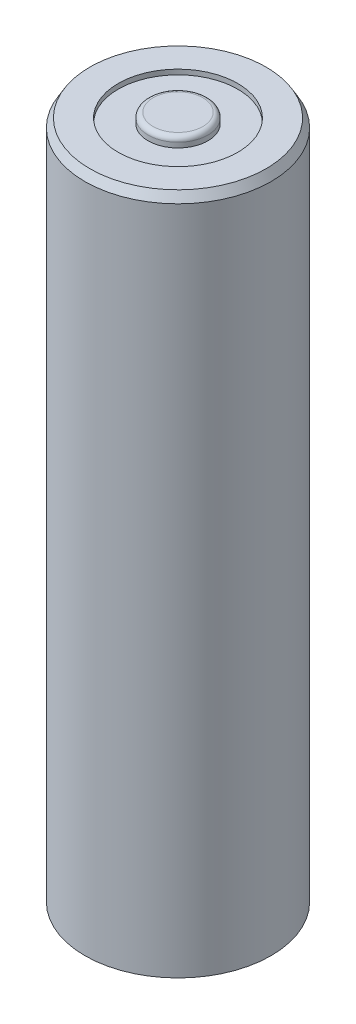
ISO-10303-21;
HEADER;
FILE_DESCRIPTION(('STEP AP214'),'2;1');
FILE_NAME('part.step','',(''),(''),'','','');
FILE_SCHEMA(('AUTOMOTIVE_DESIGN { 1 0 10303 214 1 1 1 1 }'));
ENDSEC;
DATA;
#1=APPLICATION_CONTEXT('core data for automotive mechanical design processes');
#2=APPLICATION_PROTOCOL_DEFINITION('international standard','automotive_design',2000,#1);
#3=PRODUCT_CONTEXT('',#1,'mechanical');
#4=PRODUCT('Part','Part','',(#3));
#5=PRODUCT_RELATED_PRODUCT_CATEGORY('part','',(#4));
#6=PRODUCT_DEFINITION_FORMATION('','',#4);
#7=PRODUCT_DEFINITION_CONTEXT('part definition',#1,'design');
#8=PRODUCT_DEFINITION('design','',#6,#7);
#9=PRODUCT_DEFINITION_SHAPE('','',#8);
#10=(LENGTH_UNIT() NAMED_UNIT(*) SI_UNIT(.MILLI.,.METRE.));
#11=(NAMED_UNIT(*) PLANE_ANGLE_UNIT() SI_UNIT($,.RADIAN.));
#12=(NAMED_UNIT(*) SI_UNIT($,.STERADIAN.) SOLID_ANGLE_UNIT());
#13=UNCERTAINTY_MEASURE_WITH_UNIT(LENGTH_MEASURE(1.E-05),#10,'distance_accuracy_value','');
#14=(GEOMETRIC_REPRESENTATION_CONTEXT(3) GLOBAL_UNCERTAINTY_ASSIGNED_CONTEXT((#13)) GLOBAL_UNIT_ASSIGNED_CONTEXT((#10,
#11,#12)) REPRESENTATION_CONTEXT('',''));
#15=CARTESIAN_POINT('',(0.,0.,0.));
#16=DIRECTION('',(0.,0.,1.));
#17=DIRECTION('',(1.,0.,0.));
#18=AXIS2_PLACEMENT_3D('',#15,#16,#17);
#19=CARTESIAN_POINT('',(0.,68.2,0.));
#20=DIRECTION('',(0.,-1.,0.));
#21=DIRECTION('',(0.,0.,-1.));
#22=AXIS2_PLACEMENT_3D('',#19,#20,#21);
#23=CYLINDRICAL_SURFACE('',#22,9.35);
#24=CARTESIAN_POINT('',(0.,67.3339745962156,0.));
#25=DIRECTION('',(0.,1.,0.));
#26=DIRECTION('',(0.,0.,1.));
#27=AXIS2_PLACEMENT_3D('',#24,#25,#26);
#28=CIRCLE('',#27,9.35);
#29=CARTESIAN_POINT('',(0.,67.3339745962156,9.35));
#30=VERTEX_POINT('',#29);
#31=EDGE_CURVE('E10',#30,#30,#28,.F.);
#32=ORIENTED_EDGE('',*,*,#31,.T.);
#33=EDGE_LOOP('',(#32));
#34=FACE_BOUND('',#33,.T.);
#35=CARTESIAN_POINT('',(0.,0.,0.));
#36=DIRECTION('',(0.,1.,0.));
#37=DIRECTION('',(0.,0.,1.));
#38=AXIS2_PLACEMENT_3D('',#35,#36,#37);
#39=CIRCLE('',#38,9.35);
#40=CARTESIAN_POINT('',(0.,0.,9.35));
#41=VERTEX_POINT('',#40);
#42=EDGE_CURVE('E60',#41,#41,#39,.T.);
#43=ORIENTED_EDGE('',*,*,#42,.T.);
#44=EDGE_LOOP('',(#43));
#45=FACE_BOUND('',#44,.T.);
#46=ADVANCED_FACE('F37',(#34,#45),#23,.T.);
#47=CARTESIAN_POINT('',(0.,68.2,0.));
#48=DIRECTION('',(0.,1.,0.));
#49=DIRECTION('',(0.,0.,1.));
#50=AXIS2_PLACEMENT_3D('',#47,#48,#49);
#51=PLANE('',#50);
#52=CARTESIAN_POINT('',(0.,68.2,0.));
#53=DIRECTION('',(0.,1.,0.));
#54=DIRECTION('',(0.,0.,1.));
#55=AXIS2_PLACEMENT_3D('',#52,#53,#54);
#56=CIRCLE('',#55,8.85);
#57=CARTESIAN_POINT('',(0.,68.2,8.85));
#58=VERTEX_POINT('',#57);
#59=EDGE_CURVE('E45',#58,#58,#56,.T.);
#60=ORIENTED_EDGE('',*,*,#59,.T.);
#61=EDGE_LOOP('',(#60));
#62=FACE_BOUND('',#61,.T.);
#63=CARTESIAN_POINT('',(0.,68.2,0.));
#64=DIRECTION('',(0.,1.,0.));
#65=DIRECTION('',(0.,0.,1.));
#66=AXIS2_PLACEMENT_3D('',#63,#64,#65);
#67=CIRCLE('',#66,6.);
#68=CARTESIAN_POINT('',(0.,68.2,6.));
#69=VERTEX_POINT('',#68);
#70=EDGE_CURVE('E72',#69,#69,#67,.T.);
#71=ORIENTED_EDGE('',*,*,#70,.F.);
#72=EDGE_LOOP('',(#71));
#73=FACE_BOUND('',#72,.T.);
#74=ADVANCED_FACE('F96',(#62,#73),#51,.T.);
#75=CARTESIAN_POINT('',(0.,0.,0.));
#76=DIRECTION('',(0.,1.,0.));
#77=DIRECTION('',(0.,0.,1.));
#78=AXIS2_PLACEMENT_3D('',#75,#76,#77);
#79=PLANE('',#78);
#80=CARTESIAN_POINT('',(0.,0.,0.));
#81=DIRECTION('',(0.,-1.,0.));
#82=DIRECTION('',(0.,0.,-1.));
#83=AXIS2_PLACEMENT_3D('',#80,#81,#82);
#84=CIRCLE('',#83,7.);
#85=CARTESIAN_POINT('',(0.,0.,-7.));
#86=VERTEX_POINT('',#85);
#87=EDGE_CURVE('E64',#86,#86,#84,.T.);
#88=ORIENTED_EDGE('',*,*,#87,.F.);
#89=EDGE_LOOP('',(#88));
#90=FACE_BOUND('',#89,.T.);
#91=ORIENTED_EDGE('',*,*,#42,.F.);
#92=EDGE_LOOP('',(#91));
#93=FACE_BOUND('',#92,.T.);
#94=ADVANCED_FACE('F98',(#90,#93),#79,.F.);
#95=CARTESIAN_POINT('',(0.,0.5,0.));
#96=DIRECTION('',(0.,-1.,0.));
#97=DIRECTION('',(0.,0.,-1.));
#98=AXIS2_PLACEMENT_3D('',#95,#96,#97);
#99=CYLINDRICAL_SURFACE('',#98,7.);
#100=CARTESIAN_POINT('',(0.,0.5,0.));
#101=DIRECTION('',(0.,-1.,0.));
#102=DIRECTION('',(0.,0.,-1.));
#103=AXIS2_PLACEMENT_3D('',#100,#101,#102);
#104=CIRCLE('',#103,7.);
#105=CARTESIAN_POINT('',(0.,0.5,-7.));
#106=VERTEX_POINT('',#105);
#107=EDGE_CURVE('E63',#106,#106,#104,.T.);
#108=ORIENTED_EDGE('',*,*,#107,.F.);
#109=EDGE_LOOP('',(#108));
#110=FACE_BOUND('',#109,.T.);
#111=ORIENTED_EDGE('',*,*,#87,.T.);
#112=EDGE_LOOP('',(#111));
#113=FACE_BOUND('',#112,.T.);
#114=ADVANCED_FACE('F104',(#110,#113),#99,.F.);
#115=CARTESIAN_POINT('',(0.,0.5,0.));
#116=DIRECTION('',(0.,-1.,0.));
#117=DIRECTION('',(0.,0.,-1.));
#118=AXIS2_PLACEMENT_3D('',#115,#116,#117);
#119=PLANE('',#118);
#120=ORIENTED_EDGE('',*,*,#107,.T.);
#121=EDGE_LOOP('',(#120));
#122=FACE_BOUND('',#121,.T.);
#123=ADVANCED_FACE('F92',(#122),#119,.T.);
#124=CARTESIAN_POINT('',(0.,67.7,0.));
#125=DIRECTION('',(0.,1.,0.));
#126=DIRECTION('',(0.,0.,1.));
#127=AXIS2_PLACEMENT_3D('',#124,#125,#126);
#128=CYLINDRICAL_SURFACE('',#127,6.);
#129=CARTESIAN_POINT('',(0.,67.7,0.));
#130=DIRECTION('',(0.,1.,0.));
#131=DIRECTION('',(0.,0.,1.));
#132=AXIS2_PLACEMENT_3D('',#129,#130,#131);
#133=CIRCLE('',#132,6.);
#134=CARTESIAN_POINT('',(0.,67.7,6.));
#135=VERTEX_POINT('',#134);
#136=EDGE_CURVE('E68',#135,#135,#133,.T.);
#137=ORIENTED_EDGE('',*,*,#136,.F.);
#138=EDGE_LOOP('',(#137));
#139=FACE_BOUND('',#138,.T.);
#140=ORIENTED_EDGE('',*,*,#70,.T.);
#141=EDGE_LOOP('',(#140));
#142=FACE_BOUND('',#141,.T.);
#143=ADVANCED_FACE('F86',(#139,#142),#128,.F.);
#144=CARTESIAN_POINT('',(0.,67.7,0.));
#145=DIRECTION('',(0.,1.,0.));
#146=DIRECTION('',(0.,0.,1.));
#147=AXIS2_PLACEMENT_3D('',#144,#145,#146);
#148=PLANE('',#147);
#149=CARTESIAN_POINT('',(0.,67.7,0.));
#150=DIRECTION('',(0.,1.,0.));
#151=DIRECTION('',(0.,0.,1.));
#152=AXIS2_PLACEMENT_3D('',#149,#150,#151);
#153=CIRCLE('',#152,3.);
#154=CARTESIAN_POINT('',(0.,67.7,3.));
#155=VERTEX_POINT('',#154);
#156=EDGE_CURVE('E75',#155,#155,#153,.T.);
#157=ORIENTED_EDGE('',*,*,#156,.F.);
#158=EDGE_LOOP('',(#157));
#159=FACE_BOUND('',#158,.T.);
#160=ORIENTED_EDGE('',*,*,#136,.T.);
#161=EDGE_LOOP('',(#160));
#162=FACE_BOUND('',#161,.T.);
#163=ADVANCED_FACE('F83',(#159,#162),#148,.T.);
#164=CARTESIAN_POINT('',(0.,68.7,0.));
#165=DIRECTION('',(0.,-1.,0.));
#166=DIRECTION('',(0.,0.,-1.));
#167=AXIS2_PLACEMENT_3D('',#164,#165,#166);
#168=CYLINDRICAL_SURFACE('',#167,3.);
#169=CARTESIAN_POINT('',(0.,68.2,0.));
#170=DIRECTION('',(0.,1.,0.));
#171=DIRECTION('',(0.,0.,1.));
#172=AXIS2_PLACEMENT_3D('',#169,#170,#171);
#173=CIRCLE('',#172,3.);
#174=CARTESIAN_POINT('',(0.,68.2,3.));
#175=VERTEX_POINT('',#174);
#176=EDGE_CURVE('E50',#175,#175,#173,.F.);
#177=ORIENTED_EDGE('',*,*,#176,.T.);
#178=EDGE_LOOP('',(#177));
#179=FACE_BOUND('',#178,.T.);
#180=ORIENTED_EDGE('',*,*,#156,.T.);
#181=EDGE_LOOP('',(#180));
#182=FACE_BOUND('',#181,.T.);
#183=ADVANCED_FACE('F81',(#179,#182),#168,.T.);
#184=CARTESIAN_POINT('',(0.,68.7,0.));
#185=DIRECTION('',(0.,1.,0.));
#186=DIRECTION('',(0.,0.,1.));
#187=AXIS2_PLACEMENT_3D('',#184,#185,#186);
#188=PLANE('',#187);
#189=CARTESIAN_POINT('',(0.,68.7,0.));
#190=DIRECTION('',(0.,1.,0.));
#191=DIRECTION('',(0.,0.,1.));
#192=AXIS2_PLACEMENT_3D('',#189,#190,#191);
#193=CIRCLE('',#192,2.5);
#194=CARTESIAN_POINT('',(0.,68.7,2.5));
#195=VERTEX_POINT('',#194);
#196=EDGE_CURVE('E55',#195,#195,#193,.T.);
#197=ORIENTED_EDGE('',*,*,#196,.T.);
#198=EDGE_LOOP('',(#197));
#199=FACE_BOUND('',#198,.T.);
#200=ADVANCED_FACE('F112',(#199),#188,.T.);
#201=CARTESIAN_POINT('',(0.,68.2,0.));
#202=DIRECTION('',(0.,1.,0.));
#203=DIRECTION('',(0.,0.,1.));
#204=AXIS2_PLACEMENT_3D('',#201,#202,#203);
#205=TOROIDAL_SURFACE('',#204,2.5,0.5);
#206=ORIENTED_EDGE('',*,*,#176,.F.);
#207=EDGE_LOOP('',(#206));
#208=FACE_BOUND('',#207,.T.);
#209=ORIENTED_EDGE('',*,*,#196,.F.);
#210=EDGE_LOOP('',(#209));
#211=FACE_BOUND('',#210,.T.);
#212=ADVANCED_FACE('F110',(#208,#211),#205,.T.);
#213=CARTESIAN_POINT('',(0.,68.2,0.));
#214=DIRECTION('',(0.,-1.,0.));
#215=DIRECTION('',(0.,0.,-1.));
#216=AXIS2_PLACEMENT_3D('',#213,#214,#215);
#217=CONICAL_SURFACE('',#216,8.85,0.523598775598294);
#218=ORIENTED_EDGE('',*,*,#31,.F.);
#219=EDGE_LOOP('',(#218));
#220=FACE_BOUND('',#219,.T.);
#221=ORIENTED_EDGE('',*,*,#59,.F.);
#222=EDGE_LOOP('',(#221));
#223=FACE_BOUND('',#222,.T.);
#224=ADVANCED_FACE('F39',(#220,#223),#217,.T.);
#225=CLOSED_SHELL('',(#46,#74,#94,#114,#123,#143,#163,#183,#200,#212,#224));
#226=MANIFOLD_SOLID_BREP('B2',#225);
#227=ADVANCED_BREP_SHAPE_REPRESENTATION('',(#18,#226),#14);
#228=SHAPE_DEFINITION_REPRESENTATION(#9,#227);
ENDSEC;
END-ISO-10303-21;
